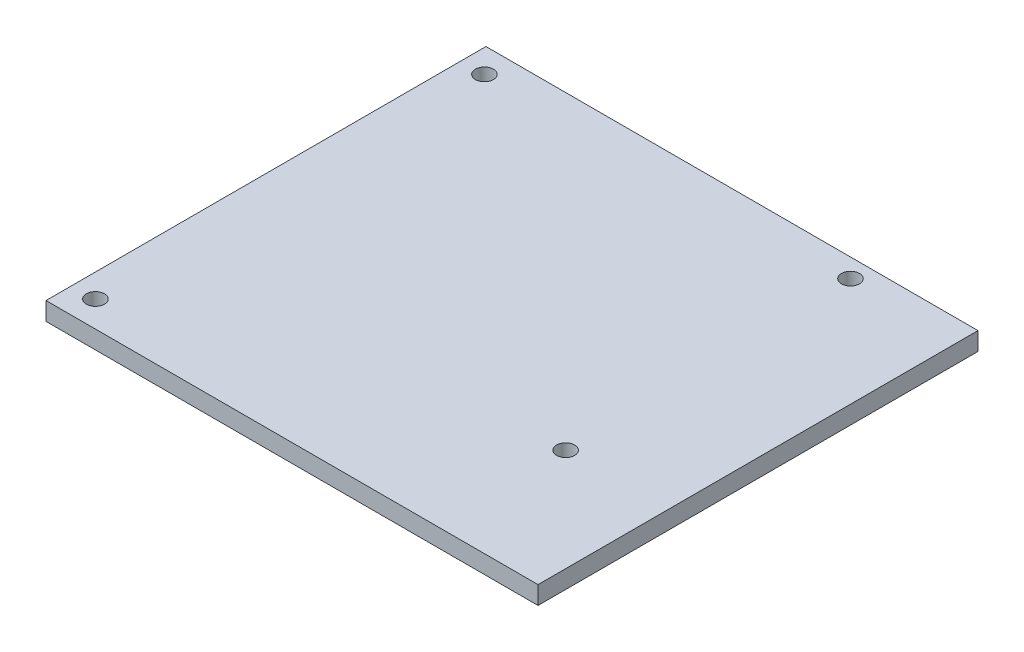
ISO-10303-21;
HEADER;
FILE_DESCRIPTION(('STEP AP214'),'2;1');
FILE_NAME('part.step','',(''),(''),'','','');
FILE_SCHEMA(('AUTOMOTIVE_DESIGN { 1 0 10303 214 1 1 1 1 }'));
ENDSEC;
DATA;
#1=APPLICATION_CONTEXT('core data for automotive mechanical design processes');
#2=APPLICATION_PROTOCOL_DEFINITION('international standard','automotive_design',2000,#1);
#3=PRODUCT_CONTEXT('',#1,'mechanical');
#4=PRODUCT('Part','Part','',(#3));
#5=PRODUCT_RELATED_PRODUCT_CATEGORY('part','',(#4));
#6=PRODUCT_DEFINITION_FORMATION('','',#4);
#7=PRODUCT_DEFINITION_CONTEXT('part definition',#1,'design');
#8=PRODUCT_DEFINITION('design','',#6,#7);
#9=PRODUCT_DEFINITION_SHAPE('','',#8);
#10=(LENGTH_UNIT() NAMED_UNIT(*) SI_UNIT(.MILLI.,.METRE.));
#11=(NAMED_UNIT(*) PLANE_ANGLE_UNIT() SI_UNIT($,.RADIAN.));
#12=(NAMED_UNIT(*) SI_UNIT($,.STERADIAN.) SOLID_ANGLE_UNIT());
#13=UNCERTAINTY_MEASURE_WITH_UNIT(LENGTH_MEASURE(1.E-05),#10,'distance_accuracy_value','');
#14=(GEOMETRIC_REPRESENTATION_CONTEXT(3) GLOBAL_UNCERTAINTY_ASSIGNED_CONTEXT((#13)) GLOBAL_UNIT_ASSIGNED_CONTEXT((#10,
#11,#12)) REPRESENTATION_CONTEXT('',''));
#15=CARTESIAN_POINT('',(0.,0.,0.));
#16=DIRECTION('',(0.,0.,1.));
#17=DIRECTION('',(1.,0.,0.));
#18=AXIS2_PLACEMENT_3D('',#15,#16,#17);
#19=CARTESIAN_POINT('',(0.,3.,16.51));
#20=DIRECTION('',(0.,0.,-1.));
#21=DIRECTION('',(-1.,0.,0.));
#22=AXIS2_PLACEMENT_3D('',#19,#20,#21);
#23=PLANE('',#22);
#24=DIRECTION('',(1.,0.,0.));
#25=VECTOR('',#24,1.);
#26=CARTESIAN_POINT('',(0.,0.,16.51));
#27=LINE('',#26,#25);
#28=CARTESIAN_POINT('',(-7.176,0.,16.51));
#29=VERTEX_POINT('',#28);
#30=CARTESIAN_POINT('',(74.421,0.,16.51));
#31=VERTEX_POINT('',#30);
#32=EDGE_CURVE('E151',#29,#31,#27,.T.);
#33=ORIENTED_EDGE('',*,*,#32,.T.);
#34=DIRECTION('',(0.,-1.,0.));
#35=VECTOR('',#34,1.);
#36=CARTESIAN_POINT('',(74.421,3.,16.51));
#37=LINE('',#36,#35);
#38=CARTESIAN_POINT('',(74.421,3.,16.51));
#39=VERTEX_POINT('',#38);
#40=EDGE_CURVE('E12',#39,#31,#37,.T.);
#41=ORIENTED_EDGE('',*,*,#40,.F.);
#42=DIRECTION('',(1.,0.,0.));
#43=VECTOR('',#42,1.);
#44=CARTESIAN_POINT('',(0.,3.,16.51));
#45=LINE('',#44,#43);
#46=CARTESIAN_POINT('',(-7.176,3.,16.51));
#47=VERTEX_POINT('',#46);
#48=EDGE_CURVE('E92',#47,#39,#45,.T.);
#49=ORIENTED_EDGE('',*,*,#48,.F.);
#50=DIRECTION('',(0.,-1.,0.));
#51=VECTOR('',#50,1.);
#52=CARTESIAN_POINT('',(-7.176,3.,16.51));
#53=LINE('',#52,#51);
#54=EDGE_CURVE('E59',#47,#29,#53,.T.);
#55=ORIENTED_EDGE('',*,*,#54,.T.);
#56=EDGE_LOOP('',(#33,#41,#49,#55));
#57=FACE_BOUND('',#56,.T.);
#58=ADVANCED_FACE('F42',(#57),#23,.F.);
#59=CARTESIAN_POINT('',(74.421,3.,0.));
#60=DIRECTION('',(-1.,0.,0.));
#61=DIRECTION('',(0.,0.,1.));
#62=AXIS2_PLACEMENT_3D('',#59,#60,#61);
#63=PLANE('',#62);
#64=DIRECTION('',(0.,0.,-1.));
#65=VECTOR('',#64,1.);
#66=CARTESIAN_POINT('',(74.421,0.,0.));
#67=LINE('',#66,#65);
#68=CARTESIAN_POINT('',(74.421,0.,-56.452));
#69=VERTEX_POINT('',#68);
#70=EDGE_CURVE('E98',#31,#69,#67,.T.);
#71=ORIENTED_EDGE('',*,*,#70,.T.);
#72=DIRECTION('',(0.,-1.,0.));
#73=VECTOR('',#72,1.);
#74=CARTESIAN_POINT('',(74.421,3.,-56.452));
#75=LINE('',#74,#73);
#76=CARTESIAN_POINT('',(74.421,3.,-56.452));
#77=VERTEX_POINT('',#76);
#78=EDGE_CURVE('E51',#77,#69,#75,.T.);
#79=ORIENTED_EDGE('',*,*,#78,.F.);
#80=DIRECTION('',(0.,0.,-1.));
#81=VECTOR('',#80,1.);
#82=CARTESIAN_POINT('',(74.421,3.,0.));
#83=LINE('',#82,#81);
#84=EDGE_CURVE('E84',#39,#77,#83,.T.);
#85=ORIENTED_EDGE('',*,*,#84,.F.);
#86=ORIENTED_EDGE('',*,*,#40,.T.);
#87=EDGE_LOOP('',(#71,#79,#85,#86));
#88=FACE_BOUND('',#87,.T.);
#89=ADVANCED_FACE('F97',(#88),#63,.F.);
#90=CARTESIAN_POINT('',(0.,3.,-56.452));
#91=DIRECTION('',(0.,0.,-1.));
#92=DIRECTION('',(-1.,0.,0.));
#93=AXIS2_PLACEMENT_3D('',#90,#91,#92);
#94=PLANE('',#93);
#95=DIRECTION('',(1.,0.,0.));
#96=VECTOR('',#95,1.);
#97=CARTESIAN_POINT('',(0.,0.,-56.452));
#98=LINE('',#97,#96);
#99=CARTESIAN_POINT('',(-7.176,0.,-56.452));
#100=VERTEX_POINT('',#99);
#101=EDGE_CURVE('E143',#100,#69,#98,.T.);
#102=ORIENTED_EDGE('',*,*,#101,.F.);
#103=DIRECTION('',(0.,-1.,0.));
#104=VECTOR('',#103,1.);
#105=CARTESIAN_POINT('',(-7.176,3.,-56.452));
#106=LINE('',#105,#104);
#107=CARTESIAN_POINT('',(-7.176,3.,-56.452));
#108=VERTEX_POINT('',#107);
#109=EDGE_CURVE('E73',#108,#100,#106,.T.);
#110=ORIENTED_EDGE('',*,*,#109,.F.);
#111=DIRECTION('',(1.,0.,0.));
#112=VECTOR('',#111,1.);
#113=CARTESIAN_POINT('',(0.,3.,-56.452));
#114=LINE('',#113,#112);
#115=EDGE_CURVE('E91',#108,#77,#114,.T.);
#116=ORIENTED_EDGE('',*,*,#115,.T.);
#117=ORIENTED_EDGE('',*,*,#78,.T.);
#118=EDGE_LOOP('',(#102,#110,#116,#117));
#119=FACE_BOUND('',#118,.T.);
#120=ADVANCED_FACE('F101',(#119),#94,.T.);
#121=CARTESIAN_POINT('',(-3.302,3.,12.192));
#122=DIRECTION('',(0.,-1.,0.));
#123=DIRECTION('',(0.,0.,-1.));
#124=AXIS2_PLACEMENT_3D('',#121,#122,#123);
#125=CYLINDRICAL_SURFACE('',#124,1.5);
#126=CARTESIAN_POINT('',(-3.302,3.,12.192));
#127=DIRECTION('',(0.,1.,0.));
#128=DIRECTION('',(0.,0.,1.));
#129=AXIS2_PLACEMENT_3D('',#126,#127,#128);
#130=CIRCLE('',#129,1.5);
#131=CARTESIAN_POINT('',(-3.302,3.,13.692));
#132=VERTEX_POINT('',#131);
#133=EDGE_CURVE('E118',#132,#132,#130,.T.);
#134=ORIENTED_EDGE('',*,*,#133,.T.);
#135=EDGE_LOOP('',(#134));
#136=FACE_BOUND('',#135,.T.);
#137=CARTESIAN_POINT('',(-3.302,0.,12.192));
#138=DIRECTION('',(0.,1.,0.));
#139=DIRECTION('',(0.,0.,1.));
#140=AXIS2_PLACEMENT_3D('',#137,#138,#139);
#141=CIRCLE('',#140,1.5);
#142=CARTESIAN_POINT('',(-3.302,0.,13.692));
#143=VERTEX_POINT('',#142);
#144=EDGE_CURVE('E153',#143,#143,#141,.T.);
#145=ORIENTED_EDGE('',*,*,#144,.F.);
#146=EDGE_LOOP('',(#145));
#147=FACE_BOUND('',#146,.T.);
#148=ADVANCED_FACE('F186',(#136,#147),#125,.F.);
#149=CARTESIAN_POINT('',(-3.30200000000001,3.,-52.324));
#150=DIRECTION('',(0.,-1.,0.));
#151=DIRECTION('',(0.,0.,-1.));
#152=AXIS2_PLACEMENT_3D('',#149,#150,#151);
#153=CYLINDRICAL_SURFACE('',#152,1.5);
#154=CARTESIAN_POINT('',(-3.30200000000001,3.,-52.324));
#155=DIRECTION('',(0.,1.,0.));
#156=DIRECTION('',(0.,0.,1.));
#157=AXIS2_PLACEMENT_3D('',#154,#155,#156);
#158=CIRCLE('',#157,1.5);
#159=CARTESIAN_POINT('',(-3.30200000000001,3.,-50.824));
#160=VERTEX_POINT('',#159);
#161=EDGE_CURVE('E123',#160,#160,#158,.T.);
#162=ORIENTED_EDGE('',*,*,#161,.T.);
#163=EDGE_LOOP('',(#162));
#164=FACE_BOUND('',#163,.T.);
#165=CARTESIAN_POINT('',(-3.30200000000001,0.,-52.324));
#166=DIRECTION('',(0.,1.,0.));
#167=DIRECTION('',(0.,0.,1.));
#168=AXIS2_PLACEMENT_3D('',#165,#166,#167);
#169=CIRCLE('',#168,1.5);
#170=CARTESIAN_POINT('',(-3.30200000000001,0.,-50.824));
#171=VERTEX_POINT('',#170);
#172=EDGE_CURVE('E156',#171,#171,#169,.T.);
#173=ORIENTED_EDGE('',*,*,#172,.F.);
#174=EDGE_LOOP('',(#173));
#175=FACE_BOUND('',#174,.T.);
#176=ADVANCED_FACE('F176',(#164,#175),#153,.F.);
#177=CARTESIAN_POINT('',(56.388,3.,-53.34));
#178=DIRECTION('',(0.,-1.,0.));
#179=DIRECTION('',(0.,0.,-1.));
#180=AXIS2_PLACEMENT_3D('',#177,#178,#179);
#181=CYLINDRICAL_SURFACE('',#180,1.5);
#182=CARTESIAN_POINT('',(56.388,3.,-53.34));
#183=DIRECTION('',(0.,1.,0.));
#184=DIRECTION('',(0.,0.,1.));
#185=AXIS2_PLACEMENT_3D('',#182,#183,#184);
#186=CIRCLE('',#185,1.5);
#187=CARTESIAN_POINT('',(56.388,3.,-51.84));
#188=VERTEX_POINT('',#187);
#189=EDGE_CURVE('E128',#188,#188,#186,.T.);
#190=ORIENTED_EDGE('',*,*,#189,.T.);
#191=EDGE_LOOP('',(#190));
#192=FACE_BOUND('',#191,.T.);
#193=CARTESIAN_POINT('',(56.388,0.,-53.34));
#194=DIRECTION('',(0.,1.,0.));
#195=DIRECTION('',(0.,0.,1.));
#196=AXIS2_PLACEMENT_3D('',#193,#194,#195);
#197=CIRCLE('',#196,1.5);
#198=CARTESIAN_POINT('',(56.388,0.,-51.84));
#199=VERTEX_POINT('',#198);
#200=EDGE_CURVE('E159',#199,#199,#197,.T.);
#201=ORIENTED_EDGE('',*,*,#200,.F.);
#202=EDGE_LOOP('',(#201));
#203=FACE_BOUND('',#202,.T.);
#204=ADVANCED_FACE('F170',(#192,#203),#181,.F.);
#205=CARTESIAN_POINT('',(57.404,3.,-5.08));
#206=DIRECTION('',(0.,-1.,0.));
#207=DIRECTION('',(0.,0.,-1.));
#208=AXIS2_PLACEMENT_3D('',#205,#206,#207);
#209=CYLINDRICAL_SURFACE('',#208,1.5);
#210=CARTESIAN_POINT('',(57.404,3.,-5.08));
#211=DIRECTION('',(0.,1.,0.));
#212=DIRECTION('',(0.,0.,1.));
#213=AXIS2_PLACEMENT_3D('',#210,#211,#212);
#214=CIRCLE('',#213,1.5);
#215=CARTESIAN_POINT('',(57.404,3.,-3.58));
#216=VERTEX_POINT('',#215);
#217=EDGE_CURVE('E133',#216,#216,#214,.T.);
#218=ORIENTED_EDGE('',*,*,#217,.T.);
#219=EDGE_LOOP('',(#218));
#220=FACE_BOUND('',#219,.T.);
#221=CARTESIAN_POINT('',(57.404,0.,-5.08));
#222=DIRECTION('',(0.,1.,0.));
#223=DIRECTION('',(0.,0.,1.));
#224=AXIS2_PLACEMENT_3D('',#221,#222,#223);
#225=CIRCLE('',#224,1.5);
#226=CARTESIAN_POINT('',(57.404,0.,-3.58));
#227=VERTEX_POINT('',#226);
#228=EDGE_CURVE('E161',#227,#227,#225,.T.);
#229=ORIENTED_EDGE('',*,*,#228,.F.);
#230=EDGE_LOOP('',(#229));
#231=FACE_BOUND('',#230,.T.);
#232=ADVANCED_FACE('F44',(#220,#231),#209,.F.);
#233=CARTESIAN_POINT('',(-7.176,3.,0.));
#234=DIRECTION('',(-1.,0.,0.));
#235=DIRECTION('',(0.,0.,1.));
#236=AXIS2_PLACEMENT_3D('',#233,#234,#235);
#237=PLANE('',#236);
#238=DIRECTION('',(0.,0.,-1.));
#239=VECTOR('',#238,1.);
#240=CARTESIAN_POINT('',(-7.176,0.,0.));
#241=LINE('',#240,#239);
#242=EDGE_CURVE('E137',#29,#100,#241,.T.);
#243=ORIENTED_EDGE('',*,*,#242,.F.);
#244=ORIENTED_EDGE('',*,*,#54,.F.);
#245=DIRECTION('',(0.,0.,-1.));
#246=VECTOR('',#245,1.);
#247=CARTESIAN_POINT('',(-7.176,3.,0.));
#248=LINE('',#247,#246);
#249=EDGE_CURVE('E103',#47,#108,#248,.T.);
#250=ORIENTED_EDGE('',*,*,#249,.T.);
#251=ORIENTED_EDGE('',*,*,#109,.T.);
#252=EDGE_LOOP('',(#243,#244,#250,#251));
#253=FACE_BOUND('',#252,.T.);
#254=ADVANCED_FACE('F169',(#253),#237,.T.);
#255=CARTESIAN_POINT('',(0.,3.,0.));
#256=DIRECTION('',(0.,1.,0.));
#257=DIRECTION('',(0.,0.,1.));
#258=AXIS2_PLACEMENT_3D('',#255,#256,#257);
#259=PLANE('',#258);
#260=ORIENTED_EDGE('',*,*,#217,.F.);
#261=EDGE_LOOP('',(#260));
#262=FACE_BOUND('',#261,.T.);
#263=ORIENTED_EDGE('',*,*,#189,.F.);
#264=EDGE_LOOP('',(#263));
#265=FACE_BOUND('',#264,.T.);
#266=ORIENTED_EDGE('',*,*,#161,.F.);
#267=EDGE_LOOP('',(#266));
#268=FACE_BOUND('',#267,.T.);
#269=ORIENTED_EDGE('',*,*,#133,.F.);
#270=EDGE_LOOP('',(#269));
#271=FACE_BOUND('',#270,.T.);
#272=ORIENTED_EDGE('',*,*,#48,.T.);
#273=ORIENTED_EDGE('',*,*,#84,.T.);
#274=ORIENTED_EDGE('',*,*,#115,.F.);
#275=ORIENTED_EDGE('',*,*,#249,.F.);
#276=EDGE_LOOP('',(#272,#273,#274,#275));
#277=FACE_BOUND('',#276,.T.);
#278=ADVANCED_FACE('F88',(#262,#265,#268,#271,#277),#259,.T.);
#279=CARTESIAN_POINT('',(0.,0.,0.));
#280=DIRECTION('',(0.,1.,0.));
#281=DIRECTION('',(0.,0.,1.));
#282=AXIS2_PLACEMENT_3D('',#279,#280,#281);
#283=PLANE('',#282);
#284=ORIENTED_EDGE('',*,*,#228,.T.);
#285=EDGE_LOOP('',(#284));
#286=FACE_BOUND('',#285,.T.);
#287=ORIENTED_EDGE('',*,*,#200,.T.);
#288=EDGE_LOOP('',(#287));
#289=FACE_BOUND('',#288,.T.);
#290=ORIENTED_EDGE('',*,*,#172,.T.);
#291=EDGE_LOOP('',(#290));
#292=FACE_BOUND('',#291,.T.);
#293=ORIENTED_EDGE('',*,*,#144,.T.);
#294=EDGE_LOOP('',(#293));
#295=FACE_BOUND('',#294,.T.);
#296=ORIENTED_EDGE('',*,*,#32,.F.);
#297=ORIENTED_EDGE('',*,*,#242,.T.);
#298=ORIENTED_EDGE('',*,*,#101,.T.);
#299=ORIENTED_EDGE('',*,*,#70,.F.);
#300=EDGE_LOOP('',(#296,#297,#298,#299));
#301=FACE_BOUND('',#300,.T.);
#302=ADVANCED_FACE('F165',(#286,#289,#292,#295,#301),#283,.F.);
#303=CLOSED_SHELL('',(#58,#89,#120,#148,#176,#204,#232,#254,#278,#302));
#304=MANIFOLD_SOLID_BREP('B2',#303);
#305=ADVANCED_BREP_SHAPE_REPRESENTATION('',(#18,#304),#14);
#306=SHAPE_DEFINITION_REPRESENTATION(#9,#305);
ENDSEC;
END-ISO-10303-21;
